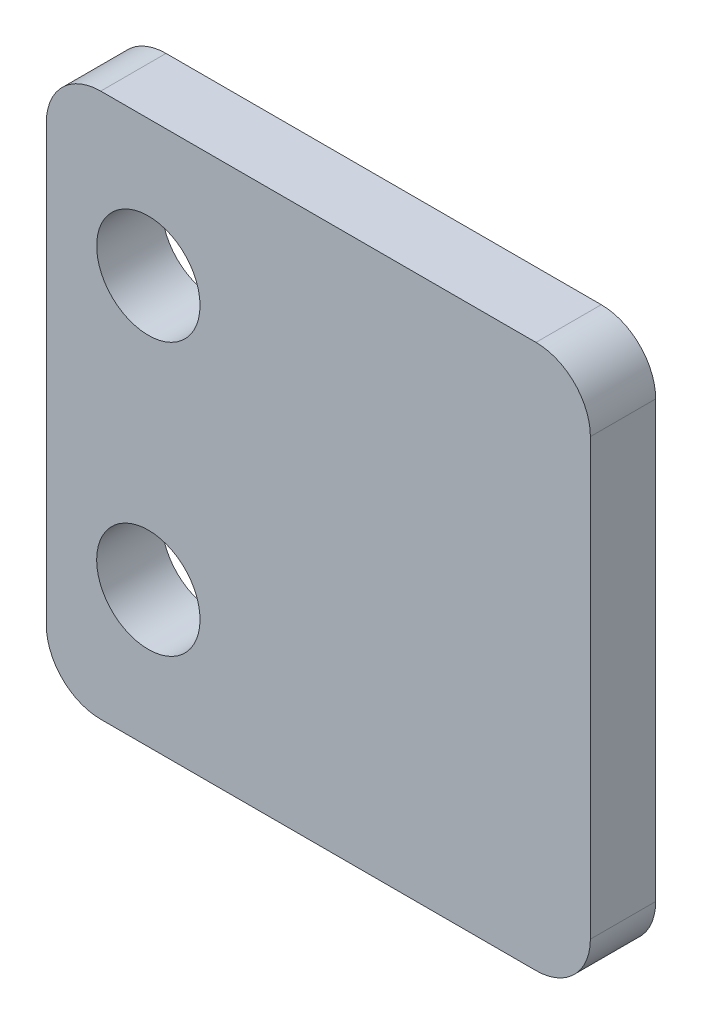
ISO-10303-21;
HEADER;
FILE_DESCRIPTION(('STEP AP214'),'2;1');
FILE_NAME('part.step','',(''),(''),'','','');
FILE_SCHEMA(('AUTOMOTIVE_DESIGN { 1 0 10303 214 1 1 1 1 }'));
ENDSEC;
DATA;
#1=APPLICATION_CONTEXT('core data for automotive mechanical design processes');
#2=APPLICATION_PROTOCOL_DEFINITION('international standard','automotive_design',2000,#1);
#3=PRODUCT_CONTEXT('',#1,'mechanical');
#4=PRODUCT('Part','Part','',(#3));
#5=PRODUCT_RELATED_PRODUCT_CATEGORY('part','',(#4));
#6=PRODUCT_DEFINITION_FORMATION('','',#4);
#7=PRODUCT_DEFINITION_CONTEXT('part definition',#1,'design');
#8=PRODUCT_DEFINITION('design','',#6,#7);
#9=PRODUCT_DEFINITION_SHAPE('','',#8);
#10=(LENGTH_UNIT() NAMED_UNIT(*) SI_UNIT(.MILLI.,.METRE.));
#11=(NAMED_UNIT(*) PLANE_ANGLE_UNIT() SI_UNIT($,.RADIAN.));
#12=(NAMED_UNIT(*) SI_UNIT($,.STERADIAN.) SOLID_ANGLE_UNIT());
#13=UNCERTAINTY_MEASURE_WITH_UNIT(LENGTH_MEASURE(1.E-05),#10,'distance_accuracy_value','');
#14=(GEOMETRIC_REPRESENTATION_CONTEXT(3) GLOBAL_UNCERTAINTY_ASSIGNED_CONTEXT((#13)) GLOBAL_UNIT_ASSIGNED_CONTEXT((#10,
#11,#12)) REPRESENTATION_CONTEXT('',''));
#15=CARTESIAN_POINT('',(0.,0.,0.));
#16=DIRECTION('',(0.,0.,1.));
#17=DIRECTION('',(1.,0.,0.));
#18=AXIS2_PLACEMENT_3D('',#15,#16,#17);
#19=CARTESIAN_POINT('',(0.,0.,3.048));
#20=DIRECTION('',(0.,0.,1.));
#21=DIRECTION('',(1.,0.,0.));
#22=AXIS2_PLACEMENT_3D('',#19,#20,#21);
#23=PLANE('',#22);
#24=CARTESIAN_POINT('',(-79.0575,-6.35,3.048));
#25=DIRECTION('',(0.,0.,-1.));
#26=DIRECTION('',(-1.,0.,0.));
#27=AXIS2_PLACEMENT_3D('',#24,#25,#26);
#28=CIRCLE('',#27,2.413);
#29=CARTESIAN_POINT('',(-81.4705,-6.35,3.048));
#30=VERTEX_POINT('',#29);
#31=EDGE_CURVE('E183',#30,#30,#28,.T.);
#32=ORIENTED_EDGE('',*,*,#31,.T.);
#33=EDGE_LOOP('',(#32));
#34=FACE_BOUND('',#33,.T.);
#35=DIRECTION('',(0.,-1.,0.));
#36=VECTOR('',#35,1.);
#37=CARTESIAN_POINT('',(-83.82,12.7,3.048));
#38=LINE('',#37,#36);
#39=CARTESIAN_POINT('',(-83.82,10.16,3.048));
#40=VERTEX_POINT('',#39);
#41=CARTESIAN_POINT('',(-83.82,-10.16,3.048));
#42=VERTEX_POINT('',#41);
#43=EDGE_CURVE('E169',#40,#42,#38,.T.);
#44=ORIENTED_EDGE('',*,*,#43,.T.);
#45=CARTESIAN_POINT('',(-81.28,-10.16,3.048));
#46=DIRECTION('',(0.,0.,1.));
#47=DIRECTION('',(1.,0.,0.));
#48=AXIS2_PLACEMENT_3D('',#45,#46,#47);
#49=CIRCLE('',#48,2.54);
#50=CARTESIAN_POINT('',(-81.28,-12.7,3.048));
#51=VERTEX_POINT('',#50);
#52=EDGE_CURVE('E149',#42,#51,#49,.T.);
#53=ORIENTED_EDGE('',*,*,#52,.T.);
#54=DIRECTION('',(-1.,0.,0.));
#55=VECTOR('',#54,1.);
#56=CARTESIAN_POINT('',(-58.42,-12.7,3.048));
#57=LINE('',#56,#55);
#58=CARTESIAN_POINT('',(-60.96,-12.7,3.048));
#59=VERTEX_POINT('',#58);
#60=EDGE_CURVE('E132',#59,#51,#57,.T.);
#61=ORIENTED_EDGE('',*,*,#60,.F.);
#62=CARTESIAN_POINT('',(-60.96,-10.16,3.048));
#63=DIRECTION('',(0.,0.,1.));
#64=DIRECTION('',(1.,0.,0.));
#65=AXIS2_PLACEMENT_3D('',#62,#63,#64);
#66=CIRCLE('',#65,2.54);
#67=CARTESIAN_POINT('',(-58.42,-10.16,3.048));
#68=VERTEX_POINT('',#67);
#69=EDGE_CURVE('E53',#59,#68,#66,.T.);
#70=ORIENTED_EDGE('',*,*,#69,.T.);
#71=DIRECTION('',(0.,-1.,0.));
#72=VECTOR('',#71,1.);
#73=CARTESIAN_POINT('',(-58.42,12.7,3.048));
#74=LINE('',#73,#72);
#75=CARTESIAN_POINT('',(-58.42,10.16,3.048));
#76=VERTEX_POINT('',#75);
#77=EDGE_CURVE('E128',#76,#68,#74,.T.);
#78=ORIENTED_EDGE('',*,*,#77,.F.);
#79=CARTESIAN_POINT('',(-60.96,10.16,3.048));
#80=DIRECTION('',(0.,0.,1.));
#81=DIRECTION('',(1.,0.,0.));
#82=AXIS2_PLACEMENT_3D('',#79,#80,#81);
#83=CIRCLE('',#82,2.54);
#84=CARTESIAN_POINT('',(-60.96,12.7,3.048));
#85=VERTEX_POINT('',#84);
#86=EDGE_CURVE('E146',#76,#85,#83,.T.);
#87=ORIENTED_EDGE('',*,*,#86,.T.);
#88=DIRECTION('',(-1.,0.,0.));
#89=VECTOR('',#88,1.);
#90=CARTESIAN_POINT('',(-58.42,12.7,3.048));
#91=LINE('',#90,#89);
#92=CARTESIAN_POINT('',(-81.28,12.7,3.048));
#93=VERTEX_POINT('',#92);
#94=EDGE_CURVE('E159',#85,#93,#91,.T.);
#95=ORIENTED_EDGE('',*,*,#94,.T.);
#96=CARTESIAN_POINT('',(-81.28,10.16,3.048));
#97=DIRECTION('',(0.,0.,1.));
#98=DIRECTION('',(1.,0.,0.));
#99=AXIS2_PLACEMENT_3D('',#96,#97,#98);
#100=CIRCLE('',#99,2.54);
#101=EDGE_CURVE('E144',#93,#40,#100,.T.);
#102=ORIENTED_EDGE('',*,*,#101,.T.);
#103=EDGE_LOOP('',(#44,#53,#61,#70,#78,#87,#95,#102));
#104=FACE_BOUND('',#103,.T.);
#105=CARTESIAN_POINT('',(-79.0575,6.35,3.048));
#106=DIRECTION('',(0.,0.,1.));
#107=DIRECTION('',(1.,0.,0.));
#108=AXIS2_PLACEMENT_3D('',#105,#106,#107);
#109=CIRCLE('',#108,2.413);
#110=CARTESIAN_POINT('',(-76.6445,6.35,3.048));
#111=VERTEX_POINT('',#110);
#112=EDGE_CURVE('E189',#111,#111,#109,.T.);
#113=ORIENTED_EDGE('',*,*,#112,.F.);
#114=EDGE_LOOP('',(#113));
#115=FACE_BOUND('',#114,.T.);
#116=ADVANCED_FACE('F38',(#34,#104,#115),#23,.T.);
#117=CARTESIAN_POINT('',(0.,0.,0.));
#118=DIRECTION('',(0.,0.,1.));
#119=DIRECTION('',(1.,0.,0.));
#120=AXIS2_PLACEMENT_3D('',#117,#118,#119);
#121=PLANE('',#120);
#122=DIRECTION('',(-1.,0.,0.));
#123=VECTOR('',#122,1.);
#124=CARTESIAN_POINT('',(-58.42,-12.7,0.));
#125=LINE('',#124,#123);
#126=CARTESIAN_POINT('',(-60.96,-12.7,0.));
#127=VERTEX_POINT('',#126);
#128=CARTESIAN_POINT('',(-81.28,-12.7,0.));
#129=VERTEX_POINT('',#128);
#130=EDGE_CURVE('E109',#127,#129,#125,.T.);
#131=ORIENTED_EDGE('',*,*,#130,.T.);
#132=CARTESIAN_POINT('',(-81.28,-10.16,0.));
#133=DIRECTION('',(0.,0.,1.));
#134=DIRECTION('',(1.,0.,0.));
#135=AXIS2_PLACEMENT_3D('',#132,#133,#134);
#136=CIRCLE('',#135,2.54);
#137=CARTESIAN_POINT('',(-83.82,-10.16,0.));
#138=VERTEX_POINT('',#137);
#139=EDGE_CURVE('E115',#129,#138,#136,.F.);
#140=ORIENTED_EDGE('',*,*,#139,.T.);
#141=DIRECTION('',(0.,-1.,0.));
#142=VECTOR('',#141,1.);
#143=CARTESIAN_POINT('',(-83.82,12.7,0.));
#144=LINE('',#143,#142);
#145=CARTESIAN_POINT('',(-83.82,10.16,0.));
#146=VERTEX_POINT('',#145);
#147=EDGE_CURVE('E125',#146,#138,#144,.T.);
#148=ORIENTED_EDGE('',*,*,#147,.F.);
#149=CARTESIAN_POINT('',(-81.28,10.16,0.));
#150=DIRECTION('',(0.,0.,1.));
#151=DIRECTION('',(1.,0.,0.));
#152=AXIS2_PLACEMENT_3D('',#149,#150,#151);
#153=CIRCLE('',#152,2.54);
#154=CARTESIAN_POINT('',(-81.28,12.7,0.));
#155=VERTEX_POINT('',#154);
#156=EDGE_CURVE('E130',#146,#155,#153,.F.);
#157=ORIENTED_EDGE('',*,*,#156,.T.);
#158=DIRECTION('',(-1.,0.,0.));
#159=VECTOR('',#158,1.);
#160=CARTESIAN_POINT('',(-58.42,12.7,0.));
#161=LINE('',#160,#159);
#162=CARTESIAN_POINT('',(-60.96,12.7,0.));
#163=VERTEX_POINT('',#162);
#164=EDGE_CURVE('E162',#163,#155,#161,.T.);
#165=ORIENTED_EDGE('',*,*,#164,.F.);
#166=CARTESIAN_POINT('',(-60.96,10.16,0.));
#167=DIRECTION('',(0.,0.,1.));
#168=DIRECTION('',(1.,0.,0.));
#169=AXIS2_PLACEMENT_3D('',#166,#167,#168);
#170=CIRCLE('',#169,2.54);
#171=CARTESIAN_POINT('',(-58.42,10.16,0.));
#172=VERTEX_POINT('',#171);
#173=EDGE_CURVE('E116',#163,#172,#170,.F.);
#174=ORIENTED_EDGE('',*,*,#173,.T.);
#175=DIRECTION('',(0.,-1.,0.));
#176=VECTOR('',#175,1.);
#177=CARTESIAN_POINT('',(-58.42,12.7,0.));
#178=LINE('',#177,#176);
#179=CARTESIAN_POINT('',(-58.42,-10.16,0.));
#180=VERTEX_POINT('',#179);
#181=EDGE_CURVE('E110',#172,#180,#178,.T.);
#182=ORIENTED_EDGE('',*,*,#181,.T.);
#183=CARTESIAN_POINT('',(-60.96,-10.16,0.));
#184=DIRECTION('',(0.,0.,1.));
#185=DIRECTION('',(1.,0.,0.));
#186=AXIS2_PLACEMENT_3D('',#183,#184,#185);
#187=CIRCLE('',#186,2.54);
#188=EDGE_CURVE('E105',#180,#127,#187,.F.);
#189=ORIENTED_EDGE('',*,*,#188,.T.);
#190=EDGE_LOOP('',(#131,#140,#148,#157,#165,#174,#182,#189));
#191=FACE_BOUND('',#190,.T.);
#192=CARTESIAN_POINT('',(-79.0575,-6.35,0.));
#193=DIRECTION('',(0.,0.,1.));
#194=DIRECTION('',(1.,0.,0.));
#195=AXIS2_PLACEMENT_3D('',#192,#193,#194);
#196=CIRCLE('',#195,2.413);
#197=CARTESIAN_POINT('',(-76.6445,-6.35,0.));
#198=VERTEX_POINT('',#197);
#199=EDGE_CURVE('E186',#198,#198,#196,.T.);
#200=ORIENTED_EDGE('',*,*,#199,.T.);
#201=EDGE_LOOP('',(#200));
#202=FACE_BOUND('',#201,.T.);
#203=CARTESIAN_POINT('',(-79.0575,6.35,0.));
#204=DIRECTION('',(0.,0.,1.));
#205=DIRECTION('',(1.,0.,0.));
#206=AXIS2_PLACEMENT_3D('',#203,#204,#205);
#207=CIRCLE('',#206,2.413);
#208=CARTESIAN_POINT('',(-76.6445,6.35,0.));
#209=VERTEX_POINT('',#208);
#210=EDGE_CURVE('E178',#209,#209,#207,.F.);
#211=ORIENTED_EDGE('',*,*,#210,.F.);
#212=EDGE_LOOP('',(#211));
#213=FACE_BOUND('',#212,.T.);
#214=ADVANCED_FACE('F107',(#191,#202,#213),#121,.F.);
#215=CARTESIAN_POINT('',(-58.42,12.7,3.048));
#216=DIRECTION('',(0.,-1.,0.));
#217=DIRECTION('',(0.,0.,-1.));
#218=AXIS2_PLACEMENT_3D('',#215,#216,#217);
#219=PLANE('',#218);
#220=ORIENTED_EDGE('',*,*,#94,.F.);
#221=DIRECTION('',(0.,0.,-1.));
#222=VECTOR('',#221,1.);
#223=CARTESIAN_POINT('',(-60.96,12.7,0.));
#224=LINE('',#223,#222);
#225=EDGE_CURVE('E11',#85,#163,#224,.T.);
#226=ORIENTED_EDGE('',*,*,#225,.T.);
#227=ORIENTED_EDGE('',*,*,#164,.T.);
#228=DIRECTION('',(0.,0.,-1.));
#229=VECTOR('',#228,1.);
#230=CARTESIAN_POINT('',(-81.28,12.7,3.048));
#231=LINE('',#230,#229);
#232=EDGE_CURVE('E46',#155,#93,#231,.F.);
#233=ORIENTED_EDGE('',*,*,#232,.T.);
#234=EDGE_LOOP('',(#220,#226,#227,#233));
#235=FACE_BOUND('',#234,.T.);
#236=ADVANCED_FACE('F158',(#235),#219,.F.);
#237=CARTESIAN_POINT('',(-83.82,12.7,3.048));
#238=DIRECTION('',(1.,0.,0.));
#239=DIRECTION('',(0.,0.,-1.));
#240=AXIS2_PLACEMENT_3D('',#237,#238,#239);
#241=PLANE('',#240);
#242=ORIENTED_EDGE('',*,*,#147,.T.);
#243=DIRECTION('',(0.,0.,-1.));
#244=VECTOR('',#243,1.);
#245=CARTESIAN_POINT('',(-83.82,-10.16,3.048));
#246=LINE('',#245,#244);
#247=EDGE_CURVE('E142',#138,#42,#246,.F.);
#248=ORIENTED_EDGE('',*,*,#247,.T.);
#249=ORIENTED_EDGE('',*,*,#43,.F.);
#250=DIRECTION('',(0.,0.,-1.));
#251=VECTOR('',#250,1.);
#252=CARTESIAN_POINT('',(-83.82,10.16,3.048));
#253=LINE('',#252,#251);
#254=EDGE_CURVE('E139',#40,#146,#253,.T.);
#255=ORIENTED_EDGE('',*,*,#254,.T.);
#256=EDGE_LOOP('',(#242,#248,#249,#255));
#257=FACE_BOUND('',#256,.T.);
#258=ADVANCED_FACE('F175',(#257),#241,.F.);
#259=CARTESIAN_POINT('',(-58.42,-12.7,3.048));
#260=DIRECTION('',(0.,-1.,0.));
#261=DIRECTION('',(0.,0.,-1.));
#262=AXIS2_PLACEMENT_3D('',#259,#260,#261);
#263=PLANE('',#262);
#264=ORIENTED_EDGE('',*,*,#60,.T.);
#265=DIRECTION('',(0.,0.,-1.));
#266=VECTOR('',#265,1.);
#267=CARTESIAN_POINT('',(-81.28,-12.7,0.));
#268=LINE('',#267,#266);
#269=EDGE_CURVE('E124',#51,#129,#268,.T.);
#270=ORIENTED_EDGE('',*,*,#269,.T.);
#271=ORIENTED_EDGE('',*,*,#130,.F.);
#272=DIRECTION('',(0.,0.,-1.));
#273=VECTOR('',#272,1.);
#274=CARTESIAN_POINT('',(-60.96,-12.7,3.048));
#275=LINE('',#274,#273);
#276=EDGE_CURVE('E122',#127,#59,#275,.F.);
#277=ORIENTED_EDGE('',*,*,#276,.T.);
#278=EDGE_LOOP('',(#264,#270,#271,#277));
#279=FACE_BOUND('',#278,.T.);
#280=ADVANCED_FACE('F121',(#279),#263,.T.);
#281=CARTESIAN_POINT('',(-58.42,12.7,3.048));
#282=DIRECTION('',(1.,0.,0.));
#283=DIRECTION('',(0.,0.,-1.));
#284=AXIS2_PLACEMENT_3D('',#281,#282,#283);
#285=PLANE('',#284);
#286=ORIENTED_EDGE('',*,*,#77,.T.);
#287=DIRECTION('',(0.,0.,-1.));
#288=VECTOR('',#287,1.);
#289=CARTESIAN_POINT('',(-58.42,-10.16,3.048));
#290=LINE('',#289,#288);
#291=EDGE_CURVE('E152',#68,#180,#290,.T.);
#292=ORIENTED_EDGE('',*,*,#291,.T.);
#293=ORIENTED_EDGE('',*,*,#181,.F.);
#294=DIRECTION('',(0.,0.,-1.));
#295=VECTOR('',#294,1.);
#296=CARTESIAN_POINT('',(-58.42,10.16,3.048));
#297=LINE('',#296,#295);
#298=EDGE_CURVE('E60',#172,#76,#297,.F.);
#299=ORIENTED_EDGE('',*,*,#298,.T.);
#300=EDGE_LOOP('',(#286,#292,#293,#299));
#301=FACE_BOUND('',#300,.T.);
#302=ADVANCED_FACE('F209',(#301),#285,.T.);
#303=CARTESIAN_POINT('',(-81.28,-10.16,3.048));
#304=DIRECTION('',(0.,0.,1.));
#305=DIRECTION('',(1.,0.,0.));
#306=AXIS2_PLACEMENT_3D('',#303,#304,#305);
#307=CYLINDRICAL_SURFACE('',#306,2.54);
#308=ORIENTED_EDGE('',*,*,#52,.F.);
#309=ORIENTED_EDGE('',*,*,#247,.F.);
#310=ORIENTED_EDGE('',*,*,#139,.F.);
#311=ORIENTED_EDGE('',*,*,#269,.F.);
#312=EDGE_LOOP('',(#308,#309,#310,#311));
#313=FACE_BOUND('',#312,.T.);
#314=ADVANCED_FACE('F212',(#313),#307,.T.);
#315=CARTESIAN_POINT('',(-60.96,-10.16,3.048));
#316=DIRECTION('',(0.,0.,-1.));
#317=DIRECTION('',(-1.,0.,0.));
#318=AXIS2_PLACEMENT_3D('',#315,#316,#317);
#319=CYLINDRICAL_SURFACE('',#318,2.54);
#320=ORIENTED_EDGE('',*,*,#69,.F.);
#321=ORIENTED_EDGE('',*,*,#276,.F.);
#322=ORIENTED_EDGE('',*,*,#188,.F.);
#323=ORIENTED_EDGE('',*,*,#291,.F.);
#324=EDGE_LOOP('',(#320,#321,#322,#323));
#325=FACE_BOUND('',#324,.T.);
#326=ADVANCED_FACE('F127',(#325),#319,.T.);
#327=CARTESIAN_POINT('',(-60.96,10.16,3.048));
#328=DIRECTION('',(0.,0.,1.));
#329=DIRECTION('',(1.,0.,0.));
#330=AXIS2_PLACEMENT_3D('',#327,#328,#329);
#331=CYLINDRICAL_SURFACE('',#330,2.54);
#332=ORIENTED_EDGE('',*,*,#86,.F.);
#333=ORIENTED_EDGE('',*,*,#298,.F.);
#334=ORIENTED_EDGE('',*,*,#173,.F.);
#335=ORIENTED_EDGE('',*,*,#225,.F.);
#336=EDGE_LOOP('',(#332,#333,#334,#335));
#337=FACE_BOUND('',#336,.T.);
#338=ADVANCED_FACE('F223',(#337),#331,.T.);
#339=CARTESIAN_POINT('',(-81.28,10.16,3.048));
#340=DIRECTION('',(0.,0.,-1.));
#341=DIRECTION('',(-1.,0.,0.));
#342=AXIS2_PLACEMENT_3D('',#339,#340,#341);
#343=CYLINDRICAL_SURFACE('',#342,2.54);
#344=ORIENTED_EDGE('',*,*,#101,.F.);
#345=ORIENTED_EDGE('',*,*,#232,.F.);
#346=ORIENTED_EDGE('',*,*,#156,.F.);
#347=ORIENTED_EDGE('',*,*,#254,.F.);
#348=EDGE_LOOP('',(#344,#345,#346,#347));
#349=FACE_BOUND('',#348,.T.);
#350=ADVANCED_FACE('F40',(#349),#343,.T.);
#351=CARTESIAN_POINT('',(-79.0575,-6.35,-0.00100000000000013));
#352=DIRECTION('',(0.,0.,1.));
#353=DIRECTION('',(1.,0.,0.));
#354=AXIS2_PLACEMENT_3D('',#351,#352,#353);
#355=CYLINDRICAL_SURFACE('',#354,2.413);
#356=ORIENTED_EDGE('',*,*,#31,.F.);
#357=EDGE_LOOP('',(#356));
#358=FACE_BOUND('',#357,.T.);
#359=ORIENTED_EDGE('',*,*,#199,.F.);
#360=EDGE_LOOP('',(#359));
#361=FACE_BOUND('',#360,.T.);
#362=ADVANCED_FACE('F206',(#358,#361),#355,.F.);
#363=CARTESIAN_POINT('',(-79.0575,6.35,-0.00100000000000013));
#364=DIRECTION('',(0.,0.,1.));
#365=DIRECTION('',(1.,0.,0.));
#366=AXIS2_PLACEMENT_3D('',#363,#364,#365);
#367=CYLINDRICAL_SURFACE('',#366,2.413);
#368=ORIENTED_EDGE('',*,*,#112,.T.);
#369=EDGE_LOOP('',(#368));
#370=FACE_BOUND('',#369,.T.);
#371=ORIENTED_EDGE('',*,*,#210,.T.);
#372=EDGE_LOOP('',(#371));
#373=FACE_BOUND('',#372,.T.);
#374=ADVANCED_FACE('F195',(#370,#373),#367,.F.);
#375=CLOSED_SHELL('',(#116,#214,#236,#258,#280,#302,#314,#326,#338,#350,#362,#374));
#376=MANIFOLD_SOLID_BREP('B2',#375);
#377=ADVANCED_BREP_SHAPE_REPRESENTATION('',(#18,#376),#14);
#378=SHAPE_DEFINITION_REPRESENTATION(#9,#377);
ENDSEC;
END-ISO-10303-21;
